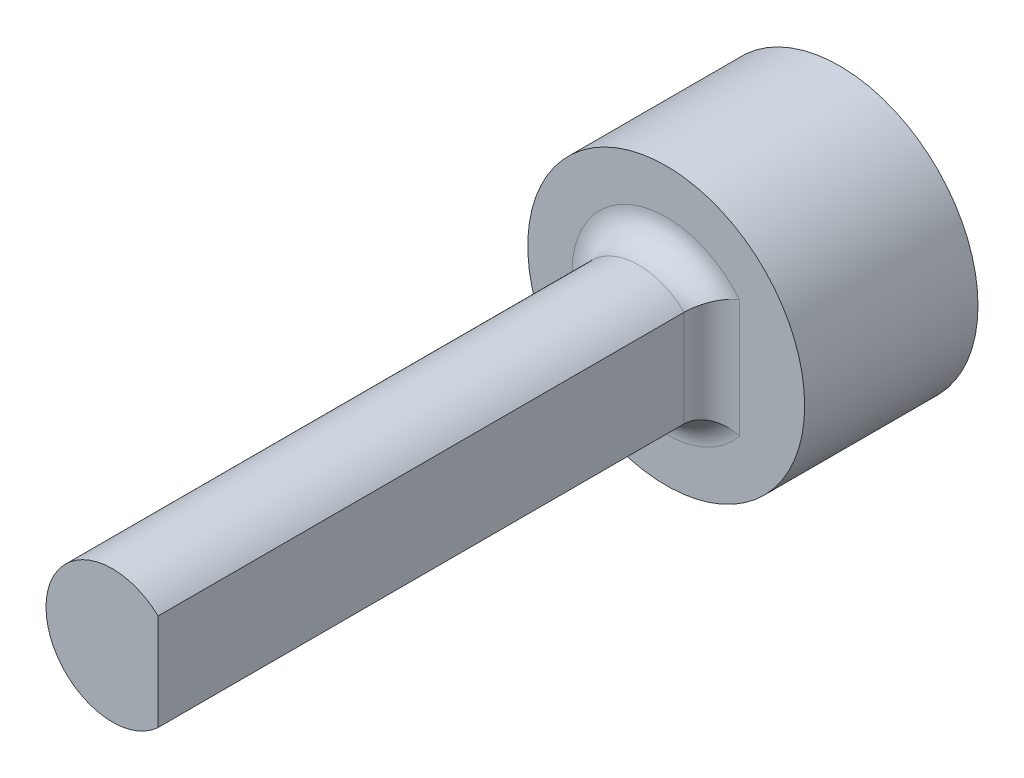
ISO-10303-21;
HEADER;
FILE_DESCRIPTION(('STEP AP214'),'2;1');
FILE_NAME('part.step','',(''),(''),'','','');
FILE_SCHEMA(('AUTOMOTIVE_DESIGN { 1 0 10303 214 1 1 1 1 }'));
ENDSEC;
DATA;
#1=APPLICATION_CONTEXT('core data for automotive mechanical design processes');
#2=APPLICATION_PROTOCOL_DEFINITION('international standard','automotive_design',2000,#1);
#3=PRODUCT_CONTEXT('',#1,'mechanical');
#4=PRODUCT('Part','Part','',(#3));
#5=PRODUCT_RELATED_PRODUCT_CATEGORY('part','',(#4));
#6=PRODUCT_DEFINITION_FORMATION('','',#4);
#7=PRODUCT_DEFINITION_CONTEXT('part definition',#1,'design');
#8=PRODUCT_DEFINITION('design','',#6,#7);
#9=PRODUCT_DEFINITION_SHAPE('','',#8);
#10=(LENGTH_UNIT() NAMED_UNIT(*) SI_UNIT(.MILLI.,.METRE.));
#11=(NAMED_UNIT(*) PLANE_ANGLE_UNIT() SI_UNIT($,.RADIAN.));
#12=(NAMED_UNIT(*) SI_UNIT($,.STERADIAN.) SOLID_ANGLE_UNIT());
#13=UNCERTAINTY_MEASURE_WITH_UNIT(LENGTH_MEASURE(1.E-05),#10,'distance_accuracy_value','');
#14=(GEOMETRIC_REPRESENTATION_CONTEXT(3) GLOBAL_UNCERTAINTY_ASSIGNED_CONTEXT((#13)) GLOBAL_UNIT_ASSIGNED_CONTEXT((#10,
#11,#12)) REPRESENTATION_CONTEXT('',''));
#15=CARTESIAN_POINT('',(0.,0.,0.));
#16=DIRECTION('',(0.,0.,1.));
#17=DIRECTION('',(1.,0.,0.));
#18=AXIS2_PLACEMENT_3D('',#15,#16,#17);
#19=CARTESIAN_POINT('',(-2.413,0.,6.1722));
#20=DIRECTION('',(1.,0.,0.));
#21=DIRECTION('',(0.,1.,0.));
#22=AXIS2_PLACEMENT_3D('',#19,#20,#21);
#23=PLANE('',#22);
#24=DIRECTION('',(0.,1.,0.));
#25=VECTOR('',#24,1.);
#26=CARTESIAN_POINT('',(-2.413,-1.39314619955457,2.54));
#27=LINE('',#26,#25);
#28=CARTESIAN_POINT('',(-2.413,-1.39314619955457,2.54));
#29=VERTEX_POINT('',#28);
#30=CARTESIAN_POINT('',(-2.413,1.39314619955457,2.54));
#31=VERTEX_POINT('',#30);
#32=EDGE_CURVE('E82',#29,#31,#27,.T.);
#33=ORIENTED_EDGE('',*,*,#32,.F.);
#34=DIRECTION('',(0.,0.,-1.));
#35=VECTOR('',#34,1.);
#36=CARTESIAN_POINT('',(-2.413,-1.39314619955457,6.1722));
#37=LINE('',#36,#35);
#38=CARTESIAN_POINT('',(-2.413,-1.39314619955457,6.1722));
#39=VERTEX_POINT('',#38);
#40=EDGE_CURVE('E147',#39,#29,#37,.T.);
#41=ORIENTED_EDGE('',*,*,#40,.F.);
#42=DIRECTION('',(0.,-1.,0.));
#43=VECTOR('',#42,1.);
#44=CARTESIAN_POINT('',(-2.413,0.,6.1722));
#45=LINE('',#44,#43);
#46=CARTESIAN_POINT('',(-2.413,1.39314619955457,6.1722));
#47=VERTEX_POINT('',#46);
#48=EDGE_CURVE('E244',#47,#39,#45,.T.);
#49=ORIENTED_EDGE('',*,*,#48,.F.);
#50=DIRECTION('',(0.,0.,-1.));
#51=VECTOR('',#50,1.);
#52=CARTESIAN_POINT('',(-2.413,1.39314619955457,6.1722));
#53=LINE('',#52,#51);
#54=EDGE_CURVE('E150',#47,#31,#53,.T.);
#55=ORIENTED_EDGE('',*,*,#54,.T.);
#56=EDGE_LOOP('',(#33,#41,#49,#55));
#57=FACE_BOUND('',#56,.T.);
#58=ADVANCED_FACE('F60',(#57),#23,.F.);
#59=CARTESIAN_POINT('',(-1.2065,-2.08971929933185,6.1722));
#60=DIRECTION('',(0.5,0.866025403784438,0.));
#61=DIRECTION('',(-0.866025403784438,0.5,0.));
#62=AXIS2_PLACEMENT_3D('',#59,#60,#61);
#63=PLANE('',#62);
#64=DIRECTION('',(-0.866025403784438,0.5,0.));
#65=VECTOR('',#64,1.);
#66=CARTESIAN_POINT('',(0.,-2.78629239910913,2.54));
#67=LINE('',#66,#65);
#68=CARTESIAN_POINT('',(0.,-2.78629239910913,2.54));
#69=VERTEX_POINT('',#68);
#70=EDGE_CURVE('E136',#69,#29,#67,.T.);
#71=ORIENTED_EDGE('',*,*,#70,.F.);
#72=DIRECTION('',(0.,0.,-1.));
#73=VECTOR('',#72,1.);
#74=CARTESIAN_POINT('',(0.,-2.78629239910913,6.1722));
#75=LINE('',#74,#73);
#76=CARTESIAN_POINT('',(0.,-2.78629239910913,6.1722));
#77=VERTEX_POINT('',#76);
#78=EDGE_CURVE('E157',#77,#69,#75,.T.);
#79=ORIENTED_EDGE('',*,*,#78,.F.);
#80=DIRECTION('',(0.866025403784438,-0.5,0.));
#81=VECTOR('',#80,1.);
#82=CARTESIAN_POINT('',(-1.2065,-2.08971929933185,6.1722));
#83=LINE('',#82,#81);
#84=EDGE_CURVE('E155',#39,#77,#83,.T.);
#85=ORIENTED_EDGE('',*,*,#84,.F.);
#86=ORIENTED_EDGE('',*,*,#40,.T.);
#87=EDGE_LOOP('',(#71,#79,#85,#86));
#88=FACE_BOUND('',#87,.T.);
#89=ADVANCED_FACE('F153',(#88),#63,.F.);
#90=CARTESIAN_POINT('',(1.2065,-2.08971929933185,6.1722));
#91=DIRECTION('',(-0.5,0.866025403784439,0.));
#92=DIRECTION('',(-0.866025403784439,-0.5,0.));
#93=AXIS2_PLACEMENT_3D('',#90,#91,#92);
#94=PLANE('',#93);
#95=DIRECTION('',(-0.866025403784439,-0.5,0.));
#96=VECTOR('',#95,1.);
#97=CARTESIAN_POINT('',(2.413,-1.39314619955457,2.54));
#98=LINE('',#97,#96);
#99=CARTESIAN_POINT('',(2.413,-1.39314619955457,2.54));
#100=VERTEX_POINT('',#99);
#101=EDGE_CURVE('E139',#100,#69,#98,.T.);
#102=ORIENTED_EDGE('',*,*,#101,.F.);
#103=DIRECTION('',(0.,0.,-1.));
#104=VECTOR('',#103,1.);
#105=CARTESIAN_POINT('',(2.413,-1.39314619955457,6.1722));
#106=LINE('',#105,#104);
#107=CARTESIAN_POINT('',(2.413,-1.39314619955457,6.1722));
#108=VERTEX_POINT('',#107);
#109=EDGE_CURVE('E161',#108,#100,#106,.T.);
#110=ORIENTED_EDGE('',*,*,#109,.F.);
#111=DIRECTION('',(0.866025403784439,0.5,0.));
#112=VECTOR('',#111,1.);
#113=CARTESIAN_POINT('',(1.2065,-2.08971929933185,6.1722));
#114=LINE('',#113,#112);
#115=EDGE_CURVE('E255',#77,#108,#114,.T.);
#116=ORIENTED_EDGE('',*,*,#115,.F.);
#117=ORIENTED_EDGE('',*,*,#78,.T.);
#118=EDGE_LOOP('',(#102,#110,#116,#117));
#119=FACE_BOUND('',#118,.T.);
#120=ADVANCED_FACE('F182',(#119),#94,.F.);
#121=CARTESIAN_POINT('',(2.413,0.,6.1722));
#122=DIRECTION('',(-1.,0.,0.));
#123=DIRECTION('',(0.,-1.,0.));
#124=AXIS2_PLACEMENT_3D('',#121,#122,#123);
#125=PLANE('',#124);
#126=DIRECTION('',(0.,-1.,0.));
#127=VECTOR('',#126,1.);
#128=CARTESIAN_POINT('',(2.413,1.39314619955457,2.54));
#129=LINE('',#128,#127);
#130=CARTESIAN_POINT('',(2.413,1.39314619955457,2.54));
#131=VERTEX_POINT('',#130);
#132=EDGE_CURVE('E276',#131,#100,#129,.T.);
#133=ORIENTED_EDGE('',*,*,#132,.F.);
#134=DIRECTION('',(0.,0.,-1.));
#135=VECTOR('',#134,1.);
#136=CARTESIAN_POINT('',(2.413,1.39314619955457,6.1722));
#137=LINE('',#136,#135);
#138=CARTESIAN_POINT('',(2.413,1.39314619955457,6.1722));
#139=VERTEX_POINT('',#138);
#140=EDGE_CURVE('E271',#139,#131,#137,.T.);
#141=ORIENTED_EDGE('',*,*,#140,.F.);
#142=DIRECTION('',(0.,1.,0.));
#143=VECTOR('',#142,1.);
#144=CARTESIAN_POINT('',(2.413,0.,6.1722));
#145=LINE('',#144,#143);
#146=EDGE_CURVE('E258',#108,#139,#145,.T.);
#147=ORIENTED_EDGE('',*,*,#146,.F.);
#148=ORIENTED_EDGE('',*,*,#109,.T.);
#149=EDGE_LOOP('',(#133,#141,#147,#148));
#150=FACE_BOUND('',#149,.T.);
#151=ADVANCED_FACE('F185',(#150),#125,.F.);
#152=CARTESIAN_POINT('',(1.2065,2.08971929933185,6.1722));
#153=DIRECTION('',(-0.5,-0.866025403784439,0.));
#154=DIRECTION('',(0.866025403784439,-0.5,0.));
#155=AXIS2_PLACEMENT_3D('',#152,#153,#154);
#156=PLANE('',#155);
#157=DIRECTION('',(0.866025403784439,-0.5,0.));
#158=VECTOR('',#157,1.);
#159=CARTESIAN_POINT('',(0.,2.78629239910913,2.54));
#160=LINE('',#159,#158);
#161=CARTESIAN_POINT('',(0.,2.78629239910913,2.54));
#162=VERTEX_POINT('',#161);
#163=EDGE_CURVE('E279',#162,#131,#160,.T.);
#164=ORIENTED_EDGE('',*,*,#163,.F.);
#165=DIRECTION('',(0.,0.,-1.));
#166=VECTOR('',#165,1.);
#167=CARTESIAN_POINT('',(0.,2.78629239910913,6.1722));
#168=LINE('',#167,#166);
#169=CARTESIAN_POINT('',(0.,2.78629239910913,6.1722));
#170=VERTEX_POINT('',#169);
#171=EDGE_CURVE('E268',#170,#162,#168,.T.);
#172=ORIENTED_EDGE('',*,*,#171,.F.);
#173=DIRECTION('',(-0.866025403784439,0.5,0.));
#174=VECTOR('',#173,1.);
#175=CARTESIAN_POINT('',(1.2065,2.08971929933185,6.1722));
#176=LINE('',#175,#174);
#177=EDGE_CURVE('E261',#139,#170,#176,.T.);
#178=ORIENTED_EDGE('',*,*,#177,.F.);
#179=ORIENTED_EDGE('',*,*,#140,.T.);
#180=EDGE_LOOP('',(#164,#172,#178,#179));
#181=FACE_BOUND('',#180,.T.);
#182=ADVANCED_FACE('F189',(#181),#156,.F.);
#183=CARTESIAN_POINT('',(-1.2065,2.08971929933185,6.1722));
#184=DIRECTION('',(0.5,-0.866025403784439,0.));
#185=DIRECTION('',(0.866025403784439,0.5,0.));
#186=AXIS2_PLACEMENT_3D('',#183,#184,#185);
#187=PLANE('',#186);
#188=DIRECTION('',(0.866025403784439,0.5,0.));
#189=VECTOR('',#188,1.);
#190=CARTESIAN_POINT('',(-2.413,1.39314619955457,2.54));
#191=LINE('',#190,#189);
#192=EDGE_CURVE('E151',#31,#162,#191,.T.);
#193=ORIENTED_EDGE('',*,*,#192,.F.);
#194=ORIENTED_EDGE('',*,*,#54,.F.);
#195=DIRECTION('',(-0.866025403784439,-0.5,0.));
#196=VECTOR('',#195,1.);
#197=CARTESIAN_POINT('',(-1.2065,2.08971929933185,6.1722));
#198=LINE('',#197,#196);
#199=EDGE_CURVE('E264',#170,#47,#198,.T.);
#200=ORIENTED_EDGE('',*,*,#199,.F.);
#201=ORIENTED_EDGE('',*,*,#171,.T.);
#202=EDGE_LOOP('',(#193,#194,#200,#201));
#203=FACE_BOUND('',#202,.T.);
#204=ADVANCED_FACE('F193',(#203),#187,.F.);
#205=CARTESIAN_POINT('',(0.,0.,6.1722));
#206=DIRECTION('',(0.,0.,1.));
#207=DIRECTION('',(1.,0.,0.));
#208=AXIS2_PLACEMENT_3D('',#205,#206,#207);
#209=PLANE('',#208);
#210=CARTESIAN_POINT('',(0.,0.,6.1722));
#211=DIRECTION('',(0.,0.,1.));
#212=DIRECTION('',(1.,0.,0.));
#213=AXIS2_PLACEMENT_3D('',#210,#211,#212);
#214=CIRCLE('',#213,4.7498);
#215=CARTESIAN_POINT('',(4.7498,0.,6.1722));
#216=VERTEX_POINT('',#215);
#217=EDGE_CURVE('E245',#216,#216,#214,.T.);
#218=ORIENTED_EDGE('',*,*,#217,.F.);
#219=EDGE_LOOP('',(#218));
#220=FACE_BOUND('',#219,.T.);
#221=ORIENTED_EDGE('',*,*,#199,.T.);
#222=ORIENTED_EDGE('',*,*,#48,.T.);
#223=ORIENTED_EDGE('',*,*,#84,.T.);
#224=ORIENTED_EDGE('',*,*,#115,.T.);
#225=ORIENTED_EDGE('',*,*,#146,.T.);
#226=ORIENTED_EDGE('',*,*,#177,.T.);
#227=EDGE_LOOP('',(#221,#222,#223,#224,#225,#226));
#228=FACE_BOUND('',#227,.T.);
#229=ADVANCED_FACE('F197',(#220,#228),#209,.F.);
#230=CARTESIAN_POINT('',(0.,0.,6.1722));
#231=DIRECTION('',(0.,0.,-1.));
#232=DIRECTION('',(-1.,0.,0.));
#233=AXIS2_PLACEMENT_3D('',#230,#231,#232);
#234=CYLINDRICAL_SURFACE('',#233,4.7498);
#235=ORIENTED_EDGE('',*,*,#217,.T.);
#236=EDGE_LOOP('',(#235));
#237=FACE_BOUND('',#236,.T.);
#238=CARTESIAN_POINT('',(0.,0.,0.));
#239=DIRECTION('',(0.,0.,1.));
#240=DIRECTION('',(1.,0.,0.));
#241=AXIS2_PLACEMENT_3D('',#238,#239,#240);
#242=CIRCLE('',#241,4.7498);
#243=CARTESIAN_POINT('',(4.7498,0.,0.));
#244=VERTEX_POINT('',#243);
#245=EDGE_CURVE('E291',#244,#244,#242,.T.);
#246=ORIENTED_EDGE('',*,*,#245,.F.);
#247=EDGE_LOOP('',(#246));
#248=FACE_BOUND('',#247,.T.);
#249=ADVANCED_FACE('F207',(#237,#248),#234,.F.);
#250=CARTESIAN_POINT('',(0.,0.,0.));
#251=DIRECTION('',(0.,0.,1.));
#252=DIRECTION('',(1.,0.,0.));
#253=AXIS2_PLACEMENT_3D('',#250,#251,#252);
#254=PLANE('',#253);
#255=ORIENTED_EDGE('',*,*,#245,.T.);
#256=EDGE_LOOP('',(#255));
#257=FACE_BOUND('',#256,.T.);
#258=CARTESIAN_POINT('',(0.,0.,0.));
#259=DIRECTION('',(0.,0.,1.));
#260=DIRECTION('',(1.,0.,0.));
#261=AXIS2_PLACEMENT_3D('',#258,#259,#260);
#262=CIRCLE('',#261,6.35);
#263=CARTESIAN_POINT('',(6.35,0.,0.));
#264=VERTEX_POINT('',#263);
#265=EDGE_CURVE('E249',#264,#264,#262,.T.);
#266=ORIENTED_EDGE('',*,*,#265,.F.);
#267=EDGE_LOOP('',(#266));
#268=FACE_BOUND('',#267,.T.);
#269=ADVANCED_FACE('F211',(#257,#268),#254,.F.);
#270=CARTESIAN_POINT('',(0.,0.,7.9502));
#271=DIRECTION('',(0.,0.,1.));
#272=DIRECTION('',(1.,0.,0.));
#273=AXIS2_PLACEMENT_3D('',#270,#271,#272);
#274=PLANE('',#273);
#275=CARTESIAN_POINT('',(0.,0.,7.9502));
#276=DIRECTION('',(0.,0.,1.));
#277=DIRECTION('',(1.,0.,0.));
#278=AXIS2_PLACEMENT_3D('',#275,#276,#277);
#279=CIRCLE('',#278,4.318);
#280=CARTESIAN_POINT('',(3.3631429826488,-2.70820849977621,7.9502));
#281=VERTEX_POINT('',#280);
#282=CARTESIAN_POINT('',(3.3631429826488,2.70820849977621,7.9502));
#283=VERTEX_POINT('',#282);
#284=EDGE_CURVE('E89',#281,#283,#279,.F.);
#285=ORIENTED_EDGE('',*,*,#284,.T.);
#286=DIRECTION('',(0.,1.,0.));
#287=VECTOR('',#286,1.);
#288=CARTESIAN_POINT('',(3.3631429826488,0.,7.9502));
#289=LINE('',#288,#287);
#290=EDGE_CURVE('E74',#283,#281,#289,.F.);
#291=ORIENTED_EDGE('',*,*,#290,.T.);
#292=EDGE_LOOP('',(#285,#291));
#293=FACE_BOUND('',#292,.T.);
#294=CARTESIAN_POINT('',(0.,0.,7.9502));
#295=DIRECTION('',(0.,0.,1.));
#296=DIRECTION('',(1.,0.,0.));
#297=AXIS2_PLACEMENT_3D('',#294,#295,#296);
#298=CIRCLE('',#297,6.35);
#299=CARTESIAN_POINT('',(6.35,0.,7.9502));
#300=VERTEX_POINT('',#299);
#301=EDGE_CURVE('E243',#300,#300,#298,.T.);
#302=ORIENTED_EDGE('',*,*,#301,.T.);
#303=EDGE_LOOP('',(#302));
#304=FACE_BOUND('',#303,.T.);
#305=ADVANCED_FACE('F203',(#293,#304),#274,.T.);
#306=CARTESIAN_POINT('',(0.,0.,7.9502));
#307=DIRECTION('',(0.,0.,-1.));
#308=DIRECTION('',(-1.,0.,0.));
#309=AXIS2_PLACEMENT_3D('',#306,#307,#308);
#310=CYLINDRICAL_SURFACE('',#309,6.35);
#311=ORIENTED_EDGE('',*,*,#301,.F.);
#312=EDGE_LOOP('',(#311));
#313=FACE_BOUND('',#312,.T.);
#314=ORIENTED_EDGE('',*,*,#265,.T.);
#315=EDGE_LOOP('',(#314));
#316=FACE_BOUND('',#315,.T.);
#317=ADVANCED_FACE('F199',(#313,#316),#310,.T.);
#318=CARTESIAN_POINT('',(0.,0.,33.3502));
#319=DIRECTION('',(0.,0.,-1.));
#320=DIRECTION('',(-1.,0.,0.));
#321=AXIS2_PLACEMENT_3D('',#318,#319,#320);
#322=CYLINDRICAL_SURFACE('',#321,3.048);
#323=DIRECTION('',(0.,0.,1.));
#324=VECTOR('',#323,1.);
#325=CARTESIAN_POINT('',(2.0931429826488,2.21563906225452,3.41721227220533));
#326=LINE('',#325,#324);
#327=CARTESIAN_POINT('',(2.0931429826488,2.21563906225452,9.2202));
#328=VERTEX_POINT('',#327);
#329=CARTESIAN_POINT('',(2.0931429826488,2.21563906225452,33.3502));
#330=VERTEX_POINT('',#329);
#331=EDGE_CURVE('E285',#328,#330,#326,.T.);
#332=ORIENTED_EDGE('',*,*,#331,.F.);
#333=CARTESIAN_POINT('',(0.,0.,9.22020000000001));
#334=DIRECTION('',(0.,0.,1.));
#335=DIRECTION('',(1.,0.,0.));
#336=AXIS2_PLACEMENT_3D('',#333,#334,#335);
#337=CIRCLE('',#336,3.048);
#338=CARTESIAN_POINT('',(2.0931429826488,-2.21563906225452,9.2202));
#339=VERTEX_POINT('',#338);
#340=EDGE_CURVE('E12',#328,#339,#337,.T.);
#341=ORIENTED_EDGE('',*,*,#340,.T.);
#342=DIRECTION('',(0.,0.,1.));
#343=VECTOR('',#342,1.);
#344=CARTESIAN_POINT('',(2.0931429826488,-2.21563906225452,3.41721227220533));
#345=LINE('',#344,#343);
#346=CARTESIAN_POINT('',(2.0931429826488,-2.21563906225452,33.3502));
#347=VERTEX_POINT('',#346);
#348=EDGE_CURVE('E286',#339,#347,#345,.T.);
#349=ORIENTED_EDGE('',*,*,#348,.T.);
#350=CARTESIAN_POINT('',(0.,0.,33.3502));
#351=DIRECTION('',(0.,0.,1.));
#352=DIRECTION('',(1.,0.,0.));
#353=AXIS2_PLACEMENT_3D('',#350,#351,#352);
#354=CIRCLE('',#353,3.048);
#355=EDGE_CURVE('E288',#330,#347,#354,.T.);
#356=ORIENTED_EDGE('',*,*,#355,.F.);
#357=EDGE_LOOP('',(#332,#341,#349,#356));
#358=FACE_BOUND('',#357,.T.);
#359=ADVANCED_FACE('F202',(#358),#322,.T.);
#360=CARTESIAN_POINT('',(0.,0.,33.3502));
#361=DIRECTION('',(0.,0.,1.));
#362=DIRECTION('',(1.,0.,0.));
#363=AXIS2_PLACEMENT_3D('',#360,#361,#362);
#364=PLANE('',#363);
#365=DIRECTION('',(0.,-1.,0.));
#366=VECTOR('',#365,1.);
#367=CARTESIAN_POINT('',(2.0931429826488,2.21563906225452,33.3502));
#368=LINE('',#367,#366);
#369=EDGE_CURVE('E239',#330,#347,#368,.T.);
#370=ORIENTED_EDGE('',*,*,#369,.F.);
#371=ORIENTED_EDGE('',*,*,#355,.T.);
#372=EDGE_LOOP('',(#370,#371));
#373=FACE_BOUND('',#372,.T.);
#374=ADVANCED_FACE('F220',(#373),#364,.T.);
#375=CARTESIAN_POINT('',(2.0931429826488,2.21563906225452,3.41721227220533));
#376=DIRECTION('',(-1.,0.,0.));
#377=DIRECTION('',(0.,0.,1.));
#378=AXIS2_PLACEMENT_3D('',#375,#376,#377);
#379=PLANE('',#378);
#380=ORIENTED_EDGE('',*,*,#348,.F.);
#381=DIRECTION('',(0.,1.,0.));
#382=VECTOR('',#381,1.);
#383=CARTESIAN_POINT('',(2.0931429826488,2.21563906225452,9.2202));
#384=LINE('',#383,#382);
#385=EDGE_CURVE('E156',#339,#328,#384,.T.);
#386=ORIENTED_EDGE('',*,*,#385,.T.);
#387=ORIENTED_EDGE('',*,*,#331,.T.);
#388=ORIENTED_EDGE('',*,*,#369,.T.);
#389=EDGE_LOOP('',(#380,#386,#387,#388));
#390=FACE_BOUND('',#389,.T.);
#391=ADVANCED_FACE('F175',(#390),#379,.F.);
#392=CARTESIAN_POINT('',(0.,0.,9.2202));
#393=DIRECTION('',(0.,0.,1.));
#394=DIRECTION('',(1.,0.,0.));
#395=AXIS2_PLACEMENT_3D('',#392,#393,#394);
#396=TOROIDAL_SURFACE('',#395,4.318,1.27);
#397=CARTESIAN_POINT('',(2.0931429826488,2.21563906225452,9.2202));
#398=CARTESIAN_POINT('',(2.09314174884363,2.21563777868922,9.18644352465829));
#399=CARTESIAN_POINT('',(2.09448978882321,2.21621955572664,9.15270420011196));
#400=CARTESIAN_POINT('',(2.09985789325946,2.21853150428008,9.08548667583275));
#401=CARTESIAN_POINT('',(2.1038772949773,2.22026139096112,9.05200841341659));
#402=CARTESIAN_POINT('',(2.11986101421464,2.22712869936872,8.9525462901495));
#403=CARTESIAN_POINT('',(2.13575133989009,2.23394407683028,8.88726138424836));
#404=CARTESIAN_POINT('',(2.17735231333105,2.25165475221357,8.76057876218962));
#405=CARTESIAN_POINT('',(2.20305823222199,2.26254808544231,8.69917919076696));
#406=CARTESIAN_POINT('',(2.26335104914504,2.28785153278122,8.58167030371357));
#407=CARTESIAN_POINT('',(2.29794263564543,2.30226350327935,8.5255638023731));
#408=CARTESIAN_POINT('',(2.37632943184002,2.33455155873237,8.41789094597084));
#409=CARTESIAN_POINT('',(2.42042162301335,2.3525374578333,8.36657439533274));
#410=CARTESIAN_POINT('',(2.51563346913096,2.39087007955088,8.27197282967931));
#411=CARTESIAN_POINT('',(2.56675549772598,2.41121759921403,8.2286905391109));
#412=CARTESIAN_POINT('',(2.67869702400057,2.4551607954878,8.1480339119877));
#413=CARTESIAN_POINT('',(2.73995499792468,2.47888550026235,8.11133849404952));
#414=CARTESIAN_POINT('',(2.86737511883448,2.52749060794661,8.04881200018068));
#415=CARTESIAN_POINT('',(2.93353820936561,2.55237123286304,8.02298302092333));
#416=CARTESIAN_POINT('',(3.05863516295656,2.59871574815022,7.9857931700165));
#417=CARTESIAN_POINT('',(3.11712164316435,2.62011847099006,7.9728209745376));
#418=CARTESIAN_POINT('',(3.23528185227719,2.66283107624368,7.95524705324392));
#419=CARTESIAN_POINT('',(3.2949528377795,2.68414105921977,7.95062785160917));
#420=CARTESIAN_POINT('',(3.35748482890594,2.70621300745717,7.95020942951634));
#421=CARTESIAN_POINT('',(3.36031390287379,2.70721103053607,7.95019997424768));
#422=CARTESIAN_POINT('',(3.3631429826488,2.70820849977621,7.9502));
#423=B_SPLINE_CURVE_WITH_KNOTS('',3,(#397,#398,#399,#400,#401,#402,#403,#404,#405,#406,#407,
#408,#409,#410,#411,#412,#413,#414,#415,#416,#417,#418,#419,#420,#421,#422),.UNSPECIFIED.,.F.,
.F.,(4,2,2,2,2,2,2,2,2,2,2,2,4),(0.,0.101203960405292,0.202382822461135,0.403930387066363,
0.605380974030168,0.806938074291012,1.01606851560082,1.22526974476869,1.45003188201147,
1.67483736711582,1.86516757284734,2.05509911412567,2.06409894378169),.UNSPECIFIED.);
#424=EDGE_CURVE('E166',#283,#328,#423,.F.);
#425=ORIENTED_EDGE('',*,*,#424,.F.);
#426=ORIENTED_EDGE('',*,*,#284,.F.);
#427=CARTESIAN_POINT('',(2.0931429826488,-2.21563906225452,9.2202));
#428=CARTESIAN_POINT('',(2.09314174884363,-2.21563777868922,9.18644352465829));
#429=CARTESIAN_POINT('',(2.09448978882321,-2.21621955572664,9.15270420011196));
#430=CARTESIAN_POINT('',(2.09985789325946,-2.21853150428008,9.08548667583275));
#431=CARTESIAN_POINT('',(2.1038772949773,-2.22026139096112,9.05200841341659));
#432=CARTESIAN_POINT('',(2.11986101421464,-2.22712869936872,8.9525462901495));
#433=CARTESIAN_POINT('',(2.13575133989009,-2.23394407683028,8.88726138424836));
#434=CARTESIAN_POINT('',(2.17735231333105,-2.25165475221357,8.76057876218962));
#435=CARTESIAN_POINT('',(2.20305823222199,-2.26254808544231,8.69917919076696));
#436=CARTESIAN_POINT('',(2.26335104914504,-2.28785153278122,8.58167030371357));
#437=CARTESIAN_POINT('',(2.29794263564543,-2.30226350327935,8.5255638023731));
#438=CARTESIAN_POINT('',(2.37632943184002,-2.33455155873237,8.41789094597084));
#439=CARTESIAN_POINT('',(2.42042162301335,-2.3525374578333,8.36657439533274));
#440=CARTESIAN_POINT('',(2.51563346913096,-2.39087007955088,8.27197282967931));
#441=CARTESIAN_POINT('',(2.56675549772598,-2.41121759921403,8.2286905391109));
#442=CARTESIAN_POINT('',(2.67869702400057,-2.4551607954878,8.1480339119877));
#443=CARTESIAN_POINT('',(2.73995499792468,-2.47888550026235,8.11133849404952));
#444=CARTESIAN_POINT('',(2.86737511883448,-2.52749060794661,8.04881200018068));
#445=CARTESIAN_POINT('',(2.93353820936561,-2.55237123286304,8.02298302092333));
#446=CARTESIAN_POINT('',(3.05863516295656,-2.59871574815022,7.9857931700165));
#447=CARTESIAN_POINT('',(3.11712164316435,-2.62011847099006,7.9728209745376));
#448=CARTESIAN_POINT('',(3.23528185227719,-2.66283107624368,7.95524705324392));
#449=CARTESIAN_POINT('',(3.2949528377795,-2.68414105921977,7.95062785160917));
#450=CARTESIAN_POINT('',(3.35748482890594,-2.70621300745717,7.95020942951634));
#451=CARTESIAN_POINT('',(3.36031390287379,-2.70721103053607,7.95019997424768));
#452=CARTESIAN_POINT('',(3.3631429826488,-2.70820849977621,7.9502));
#453=B_SPLINE_CURVE_WITH_KNOTS('',3,(#427,#428,#429,#430,#431,#432,#433,#434,#435,#436,#437,
#438,#439,#440,#441,#442,#443,#444,#445,#446,#447,#448,#449,#450,#451,#452),.UNSPECIFIED.,.F.,
.F.,(4,2,2,2,2,2,2,2,2,2,2,2,4),(0.,0.101203960405292,0.202382822461135,0.403930387066363,
0.605380974030168,0.806938074291012,1.01606851560082,1.22526974476869,1.45003188201147,
1.67483736711582,1.86516757284734,2.05509911412567,2.06409894378169),.UNSPECIFIED.);
#454=EDGE_CURVE('E65',#339,#281,#453,.T.);
#455=ORIENTED_EDGE('',*,*,#454,.F.);
#456=ORIENTED_EDGE('',*,*,#340,.F.);
#457=EDGE_LOOP('',(#425,#426,#455,#456));
#458=FACE_BOUND('',#457,.T.);
#459=ADVANCED_FACE('F171',(#458),#396,.F.);
#460=CARTESIAN_POINT('',(3.3631429826488,2.21563906225452,9.2202));
#461=DIRECTION('',(0.,1.,0.));
#462=DIRECTION('',(0.,0.,1.));
#463=AXIS2_PLACEMENT_3D('',#460,#461,#462);
#464=CYLINDRICAL_SURFACE('',#463,1.27);
#465=ORIENTED_EDGE('',*,*,#454,.T.);
#466=ORIENTED_EDGE('',*,*,#290,.F.);
#467=ORIENTED_EDGE('',*,*,#424,.T.);
#468=ORIENTED_EDGE('',*,*,#385,.F.);
#469=EDGE_LOOP('',(#465,#466,#467,#468));
#470=FACE_BOUND('',#469,.T.);
#471=ADVANCED_FACE('F62',(#470),#464,.F.);
#472=CARTESIAN_POINT('',(0.,0.,2.54));
#473=DIRECTION('',(0.,0.,-1.));
#474=DIRECTION('',(-1.,0.,0.));
#475=AXIS2_PLACEMENT_3D('',#472,#473,#474);
#476=PLANE('',#475);
#477=ORIENTED_EDGE('',*,*,#70,.T.);
#478=ORIENTED_EDGE('',*,*,#32,.T.);
#479=ORIENTED_EDGE('',*,*,#192,.T.);
#480=ORIENTED_EDGE('',*,*,#163,.T.);
#481=ORIENTED_EDGE('',*,*,#132,.T.);
#482=ORIENTED_EDGE('',*,*,#101,.T.);
#483=EDGE_LOOP('',(#477,#478,#479,#480,#481,#482));
#484=FACE_BOUND('',#483,.T.);
#485=ADVANCED_FACE('F137',(#484),#476,.T.);
#486=CLOSED_SHELL('',(#58,#89,#120,#151,#182,#204,#229,#249,#269,#305,#317,#359,#374,#391,#459,
#471,#485));
#487=MANIFOLD_SOLID_BREP('B2',#486);
#488=ADVANCED_BREP_SHAPE_REPRESENTATION('',(#18,#487),#14);
#489=SHAPE_DEFINITION_REPRESENTATION(#9,#488);
ENDSEC;
END-ISO-10303-21;
